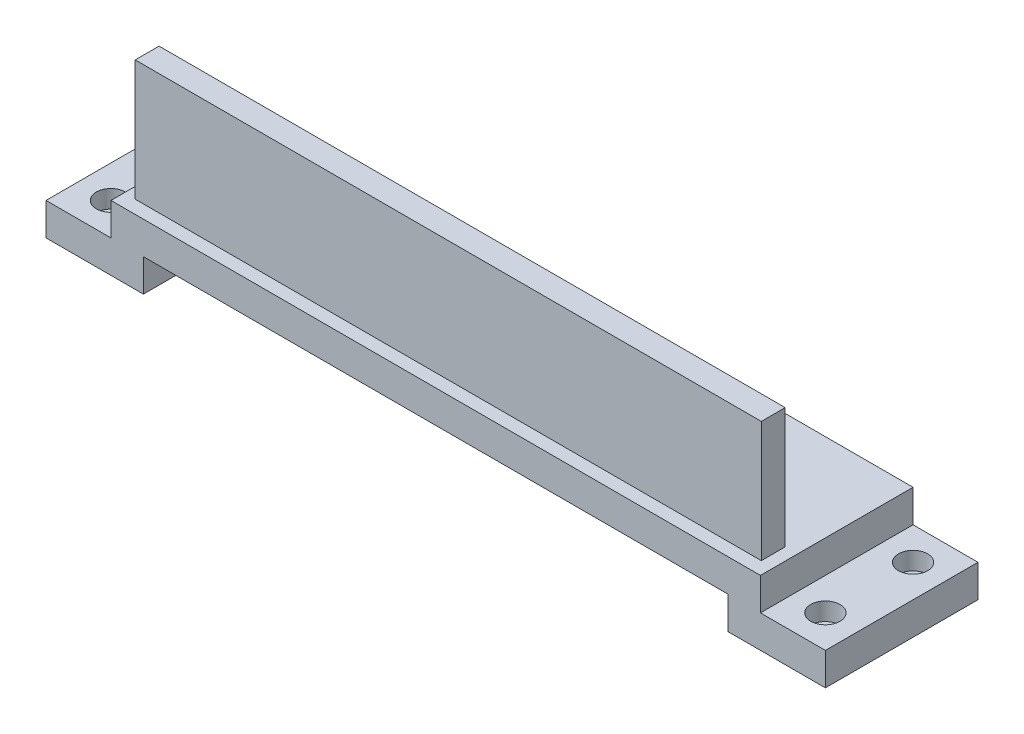
ISO-10303-21;
HEADER;
FILE_DESCRIPTION(('STEP AP214'),'2;1');
FILE_NAME('part.step','',(''),(''),'','','');
FILE_SCHEMA(('AUTOMOTIVE_DESIGN { 1 0 10303 214 1 1 1 1 }'));
ENDSEC;
DATA;
#1=APPLICATION_CONTEXT('core data for automotive mechanical design processes');
#2=APPLICATION_PROTOCOL_DEFINITION('international standard','automotive_design',2000,#1);
#3=PRODUCT_CONTEXT('',#1,'mechanical');
#4=PRODUCT('Part','Part','',(#3));
#5=PRODUCT_RELATED_PRODUCT_CATEGORY('part','',(#4));
#6=PRODUCT_DEFINITION_FORMATION('','',#4);
#7=PRODUCT_DEFINITION_CONTEXT('part definition',#1,'design');
#8=PRODUCT_DEFINITION('design','',#6,#7);
#9=PRODUCT_DEFINITION_SHAPE('','',#8);
#10=(LENGTH_UNIT() NAMED_UNIT(*) SI_UNIT(.MILLI.,.METRE.));
#11=(NAMED_UNIT(*) PLANE_ANGLE_UNIT() SI_UNIT($,.RADIAN.));
#12=(NAMED_UNIT(*) SI_UNIT($,.STERADIAN.) SOLID_ANGLE_UNIT());
#13=UNCERTAINTY_MEASURE_WITH_UNIT(LENGTH_MEASURE(1.E-05),#10,'distance_accuracy_value','');
#14=(GEOMETRIC_REPRESENTATION_CONTEXT(3) GLOBAL_UNCERTAINTY_ASSIGNED_CONTEXT((#13)) GLOBAL_UNIT_ASSIGNED_CONTEXT((#10,
#11,#12)) REPRESENTATION_CONTEXT('',''));
#15=CARTESIAN_POINT('',(0.,0.,0.));
#16=DIRECTION('',(0.,0.,1.));
#17=DIRECTION('',(1.,0.,0.));
#18=AXIS2_PLACEMENT_3D('',#15,#16,#17);
#19=CARTESIAN_POINT('',(240.,20.,47.));
#20=DIRECTION('',(0.,0.,1.));
#21=DIRECTION('',(1.,0.,0.));
#22=AXIS2_PLACEMENT_3D('',#19,#20,#21);
#23=PLANE('',#22);
#24=DIRECTION('',(-1.,0.,0.));
#25=VECTOR('',#24,1.);
#26=CARTESIAN_POINT('',(240.,0.,47.));
#27=LINE('',#26,#25);
#28=CARTESIAN_POINT('',(240.,0.,47.));
#29=VERTEX_POINT('',#28);
#30=CARTESIAN_POINT('',(200.,0.,47.));
#31=VERTEX_POINT('',#30);
#32=EDGE_CURVE('E271',#29,#31,#27,.T.);
#33=ORIENTED_EDGE('',*,*,#32,.T.);
#34=DIRECTION('',(0.,1.,0.));
#35=VECTOR('',#34,1.);
#36=CARTESIAN_POINT('',(200.,0.,47.));
#37=LINE('',#36,#35);
#38=CARTESIAN_POINT('',(200.,20.,47.));
#39=VERTEX_POINT('',#38);
#40=EDGE_CURVE('E276',#31,#39,#37,.T.);
#41=ORIENTED_EDGE('',*,*,#40,.T.);
#42=DIRECTION('',(-1.,0.,0.));
#43=VECTOR('',#42,1.);
#44=CARTESIAN_POINT('',(240.,20.,47.));
#45=LINE('',#44,#43);
#46=CARTESIAN_POINT('',(-200.,20.,47.));
#47=VERTEX_POINT('',#46);
#48=EDGE_CURVE('E356',#39,#47,#45,.T.);
#49=ORIENTED_EDGE('',*,*,#48,.T.);
#50=DIRECTION('',(0.,-1.,0.));
#51=VECTOR('',#50,1.);
#52=CARTESIAN_POINT('',(-200.,20.,47.));
#53=LINE('',#52,#51);
#54=CARTESIAN_POINT('',(-200.,0.,47.));
#55=VERTEX_POINT('',#54);
#56=EDGE_CURVE('E331',#47,#55,#53,.T.);
#57=ORIENTED_EDGE('',*,*,#56,.T.);
#58=DIRECTION('',(-1.,0.,0.));
#59=VECTOR('',#58,1.);
#60=CARTESIAN_POINT('',(-200.,0.,47.));
#61=LINE('',#60,#59);
#62=CARTESIAN_POINT('',(-240.,0.,47.));
#63=VERTEX_POINT('',#62);
#64=EDGE_CURVE('E340',#55,#63,#61,.T.);
#65=ORIENTED_EDGE('',*,*,#64,.T.);
#66=DIRECTION('',(0.,-1.,0.));
#67=VECTOR('',#66,1.);
#68=CARTESIAN_POINT('',(-240.,20.,47.));
#69=LINE('',#68,#67);
#70=CARTESIAN_POINT('',(-240.,-20.,47.));
#71=VERTEX_POINT('',#70);
#72=EDGE_CURVE('E384',#63,#71,#69,.T.);
#73=ORIENTED_EDGE('',*,*,#72,.T.);
#74=DIRECTION('',(-1.,0.,0.));
#75=VECTOR('',#74,1.);
#76=CARTESIAN_POINT('',(240.,-20.,47.));
#77=LINE('',#76,#75);
#78=CARTESIAN_POINT('',(-180.,-20.,47.));
#79=VERTEX_POINT('',#78);
#80=EDGE_CURVE('E367',#79,#71,#77,.T.);
#81=ORIENTED_EDGE('',*,*,#80,.F.);
#82=DIRECTION('',(0.,1.,0.));
#83=VECTOR('',#82,1.);
#84=CARTESIAN_POINT('',(-180.,-20.,47.));
#85=LINE('',#84,#83);
#86=CARTESIAN_POINT('',(-180.,0.,47.));
#87=VERTEX_POINT('',#86);
#88=EDGE_CURVE('E301',#79,#87,#85,.T.);
#89=ORIENTED_EDGE('',*,*,#88,.T.);
#90=DIRECTION('',(1.,0.,0.));
#91=VECTOR('',#90,1.);
#92=CARTESIAN_POINT('',(-180.,0.,47.));
#93=LINE('',#92,#91);
#94=CARTESIAN_POINT('',(180.,0.,47.));
#95=VERTEX_POINT('',#94);
#96=EDGE_CURVE('E306',#87,#95,#93,.T.);
#97=ORIENTED_EDGE('',*,*,#96,.T.);
#98=DIRECTION('',(0.,-1.,0.));
#99=VECTOR('',#98,1.);
#100=CARTESIAN_POINT('',(180.,0.,47.));
#101=LINE('',#100,#99);
#102=CARTESIAN_POINT('',(180.,-20.,47.));
#103=VERTEX_POINT('',#102);
#104=EDGE_CURVE('E300',#95,#103,#101,.T.);
#105=ORIENTED_EDGE('',*,*,#104,.T.);
#106=CARTESIAN_POINT('',(240.,-20.,47.));
#107=VERTEX_POINT('',#106);
#108=EDGE_CURVE('E369',#107,#103,#77,.T.);
#109=ORIENTED_EDGE('',*,*,#108,.F.);
#110=DIRECTION('',(0.,-1.,0.));
#111=VECTOR('',#110,1.);
#112=CARTESIAN_POINT('',(240.,20.,47.));
#113=LINE('',#112,#111);
#114=EDGE_CURVE('E50',#29,#107,#113,.T.);
#115=ORIENTED_EDGE('',*,*,#114,.F.);
#116=EDGE_LOOP('',(#33,#41,#49,#57,#65,#73,#81,#89,#97,#105,#109,#115));
#117=FACE_BOUND('',#116,.T.);
#118=ADVANCED_FACE('F43',(#117),#23,.T.);
#119=CARTESIAN_POINT('',(0.,-20.,0.));
#120=DIRECTION('',(0.,-1.,0.));
#121=DIRECTION('',(0.,0.,-1.));
#122=AXIS2_PLACEMENT_3D('',#119,#120,#121);
#123=PLANE('',#122);
#124=CARTESIAN_POINT('',(220.,-20.,27.));
#125=DIRECTION('',(0.,1.,0.));
#126=DIRECTION('',(0.,0.,1.));
#127=AXIS2_PLACEMENT_3D('',#124,#125,#126);
#128=CIRCLE('',#127,5.50000000000001);
#129=CARTESIAN_POINT('',(220.,-20.,32.5));
#130=VERTEX_POINT('',#129);
#131=EDGE_CURVE('E223',#130,#130,#128,.T.);
#132=ORIENTED_EDGE('',*,*,#131,.T.);
#133=EDGE_LOOP('',(#132));
#134=FACE_BOUND('',#133,.T.);
#135=CARTESIAN_POINT('',(220.,-20.,-27.));
#136=DIRECTION('',(0.,1.,0.));
#137=DIRECTION('',(0.,0.,1.));
#138=AXIS2_PLACEMENT_3D('',#135,#136,#137);
#139=CIRCLE('',#138,5.50000000000001);
#140=CARTESIAN_POINT('',(220.,-20.,-21.5));
#141=VERTEX_POINT('',#140);
#142=EDGE_CURVE('E240',#141,#141,#139,.T.);
#143=ORIENTED_EDGE('',*,*,#142,.T.);
#144=EDGE_LOOP('',(#143));
#145=FACE_BOUND('',#144,.T.);
#146=ORIENTED_EDGE('',*,*,#108,.T.);
#147=DIRECTION('',(0.,0.,-1.));
#148=VECTOR('',#147,1.);
#149=CARTESIAN_POINT('',(180.,-20.,47.));
#150=LINE('',#149,#148);
#151=CARTESIAN_POINT('',(180.,-20.,-47.));
#152=VERTEX_POINT('',#151);
#153=EDGE_CURVE('E309',#103,#152,#150,.T.);
#154=ORIENTED_EDGE('',*,*,#153,.T.);
#155=DIRECTION('',(1.,0.,0.));
#156=VECTOR('',#155,1.);
#157=CARTESIAN_POINT('',(-240.,-20.,-47.));
#158=LINE('',#157,#156);
#159=CARTESIAN_POINT('',(240.,-20.,-47.));
#160=VERTEX_POINT('',#159);
#161=EDGE_CURVE('E377',#152,#160,#158,.T.);
#162=ORIENTED_EDGE('',*,*,#161,.T.);
#163=DIRECTION('',(0.,0.,1.));
#164=VECTOR('',#163,1.);
#165=CARTESIAN_POINT('',(240.,-20.,-47.));
#166=LINE('',#165,#164);
#167=EDGE_CURVE('E355',#160,#107,#166,.T.);
#168=ORIENTED_EDGE('',*,*,#167,.T.);
#169=EDGE_LOOP('',(#146,#154,#162,#168));
#170=FACE_BOUND('',#169,.T.);
#171=ADVANCED_FACE('F405',(#134,#145,#170),#123,.T.);
#172=CARTESIAN_POINT('',(-240.,20.,47.));
#173=DIRECTION('',(-1.,0.,0.));
#174=DIRECTION('',(0.,0.,1.));
#175=AXIS2_PLACEMENT_3D('',#172,#173,#174);
#176=PLANE('',#175);
#177=ORIENTED_EDGE('',*,*,#72,.F.);
#178=DIRECTION('',(0.,0.,-1.));
#179=VECTOR('',#178,1.);
#180=CARTESIAN_POINT('',(-240.,0.,47.));
#181=LINE('',#180,#179);
#182=CARTESIAN_POINT('',(-240.,0.,-47.));
#183=VERTEX_POINT('',#182);
#184=EDGE_CURVE('E350',#63,#183,#181,.T.);
#185=ORIENTED_EDGE('',*,*,#184,.T.);
#186=DIRECTION('',(0.,-1.,0.));
#187=VECTOR('',#186,1.);
#188=CARTESIAN_POINT('',(-240.,20.,-47.));
#189=LINE('',#188,#187);
#190=CARTESIAN_POINT('',(-240.,-20.,-47.));
#191=VERTEX_POINT('',#190);
#192=EDGE_CURVE('E52',#183,#191,#189,.T.);
#193=ORIENTED_EDGE('',*,*,#192,.T.);
#194=DIRECTION('',(0.,0.,-1.));
#195=VECTOR('',#194,1.);
#196=CARTESIAN_POINT('',(-240.,-20.,47.));
#197=LINE('',#196,#195);
#198=EDGE_CURVE('E372',#71,#191,#197,.T.);
#199=ORIENTED_EDGE('',*,*,#198,.F.);
#200=EDGE_LOOP('',(#177,#185,#193,#199));
#201=FACE_BOUND('',#200,.T.);
#202=ADVANCED_FACE('F478',(#201),#176,.T.);
#203=CARTESIAN_POINT('',(0.,20.,0.));
#204=DIRECTION('',(0.,-1.,0.));
#205=DIRECTION('',(0.,0.,-1.));
#206=AXIS2_PLACEMENT_3D('',#203,#204,#205);
#207=PLANE('',#206);
#208=DIRECTION('',(0.,0.,-1.));
#209=VECTOR('',#208,1.);
#210=CARTESIAN_POINT('',(-193.189875817613,20.,38.8700350744145));
#211=LINE('',#210,#209);
#212=CARTESIAN_POINT('',(-193.189875817613,20.,38.8700350744145));
#213=VERTEX_POINT('',#212);
#214=CARTESIAN_POINT('',(-193.189875817613,20.,24.1729073845861));
#215=VERTEX_POINT('',#214);
#216=EDGE_CURVE('E183',#213,#215,#211,.T.);
#217=ORIENTED_EDGE('',*,*,#216,.T.);
#218=DIRECTION('',(1.,0.,0.));
#219=VECTOR('',#218,1.);
#220=CARTESIAN_POINT('',(-193.189875817613,20.,24.1729073845861));
#221=LINE('',#220,#219);
#222=CARTESIAN_POINT('',(192.416342781306,20.,24.1729073845861));
#223=VERTEX_POINT('',#222);
#224=EDGE_CURVE('E64',#215,#223,#221,.T.);
#225=ORIENTED_EDGE('',*,*,#224,.T.);
#226=DIRECTION('',(0.,0.,-1.));
#227=VECTOR('',#226,1.);
#228=CARTESIAN_POINT('',(192.416342781306,20.,38.8700350744145));
#229=LINE('',#228,#227);
#230=CARTESIAN_POINT('',(192.416342781306,20.,38.8700350744145));
#231=VERTEX_POINT('',#230);
#232=EDGE_CURVE('E176',#231,#223,#229,.T.);
#233=ORIENTED_EDGE('',*,*,#232,.F.);
#234=DIRECTION('',(1.,0.,0.));
#235=VECTOR('',#234,1.);
#236=CARTESIAN_POINT('',(-193.189875817613,20.,38.8700350744145));
#237=LINE('',#236,#235);
#238=EDGE_CURVE('E186',#213,#231,#237,.T.);
#239=ORIENTED_EDGE('',*,*,#238,.F.);
#240=EDGE_LOOP('',(#217,#225,#233,#239));
#241=FACE_BOUND('',#240,.T.);
#242=ORIENTED_EDGE('',*,*,#48,.F.);
#243=DIRECTION('',(0.,0.,-1.));
#244=VECTOR('',#243,1.);
#245=CARTESIAN_POINT('',(200.,20.,47.));
#246=LINE('',#245,#244);
#247=CARTESIAN_POINT('',(200.,20.,-47.));
#248=VERTEX_POINT('',#247);
#249=EDGE_CURVE('E290',#39,#248,#246,.T.);
#250=ORIENTED_EDGE('',*,*,#249,.T.);
#251=DIRECTION('',(1.,0.,0.));
#252=VECTOR('',#251,1.);
#253=CARTESIAN_POINT('',(-240.,20.,-47.));
#254=LINE('',#253,#252);
#255=CARTESIAN_POINT('',(-200.,20.,-47.));
#256=VERTEX_POINT('',#255);
#257=EDGE_CURVE('E363',#256,#248,#254,.T.);
#258=ORIENTED_EDGE('',*,*,#257,.F.);
#259=DIRECTION('',(0.,0.,-1.));
#260=VECTOR('',#259,1.);
#261=CARTESIAN_POINT('',(-200.,20.,47.));
#262=LINE('',#261,#260);
#263=EDGE_CURVE('E341',#47,#256,#262,.T.);
#264=ORIENTED_EDGE('',*,*,#263,.F.);
#265=EDGE_LOOP('',(#242,#250,#258,#264));
#266=FACE_BOUND('',#265,.T.);
#267=ADVANCED_FACE('F489',(#241,#266),#207,.F.);
#268=CARTESIAN_POINT('',(240.,20.,-47.));
#269=DIRECTION('',(1.,0.,0.));
#270=DIRECTION('',(0.,0.,-1.));
#271=AXIS2_PLACEMENT_3D('',#268,#269,#270);
#272=PLANE('',#271);
#273=DIRECTION('',(0.,0.,-1.));
#274=VECTOR('',#273,1.);
#275=CARTESIAN_POINT('',(240.,0.,47.));
#276=LINE('',#275,#274);
#277=CARTESIAN_POINT('',(240.,0.,-47.));
#278=VERTEX_POINT('',#277);
#279=EDGE_CURVE('E281',#29,#278,#276,.T.);
#280=ORIENTED_EDGE('',*,*,#279,.F.);
#281=ORIENTED_EDGE('',*,*,#114,.T.);
#282=ORIENTED_EDGE('',*,*,#167,.F.);
#283=DIRECTION('',(0.,-1.,0.));
#284=VECTOR('',#283,1.);
#285=CARTESIAN_POINT('',(240.,20.,-47.));
#286=LINE('',#285,#284);
#287=EDGE_CURVE('E11',#278,#160,#286,.T.);
#288=ORIENTED_EDGE('',*,*,#287,.F.);
#289=EDGE_LOOP('',(#280,#281,#282,#288));
#290=FACE_BOUND('',#289,.T.);
#291=ADVANCED_FACE('F44',(#290),#272,.T.);
#292=CARTESIAN_POINT('',(-240.,20.,-47.));
#293=DIRECTION('',(0.,0.,-1.));
#294=DIRECTION('',(-1.,0.,0.));
#295=AXIS2_PLACEMENT_3D('',#292,#293,#294);
#296=PLANE('',#295);
#297=DIRECTION('',(-1.,0.,0.));
#298=VECTOR('',#297,1.);
#299=CARTESIAN_POINT('',(240.,0.,-47.));
#300=LINE('',#299,#298);
#301=CARTESIAN_POINT('',(200.,0.,-47.));
#302=VERTEX_POINT('',#301);
#303=EDGE_CURVE('E68',#278,#302,#300,.T.);
#304=ORIENTED_EDGE('',*,*,#303,.F.);
#305=ORIENTED_EDGE('',*,*,#287,.T.);
#306=ORIENTED_EDGE('',*,*,#161,.F.);
#307=DIRECTION('',(0.,-1.,0.));
#308=VECTOR('',#307,1.);
#309=CARTESIAN_POINT('',(180.,0.,-47.));
#310=LINE('',#309,#308);
#311=CARTESIAN_POINT('',(180.,0.,-47.));
#312=VERTEX_POINT('',#311);
#313=EDGE_CURVE('E293',#312,#152,#310,.T.);
#314=ORIENTED_EDGE('',*,*,#313,.F.);
#315=DIRECTION('',(1.,0.,0.));
#316=VECTOR('',#315,1.);
#317=CARTESIAN_POINT('',(-180.,0.,-47.));
#318=LINE('',#317,#316);
#319=CARTESIAN_POINT('',(-180.,0.,-47.));
#320=VERTEX_POINT('',#319);
#321=EDGE_CURVE('E305',#320,#312,#318,.T.);
#322=ORIENTED_EDGE('',*,*,#321,.F.);
#323=DIRECTION('',(0.,1.,0.));
#324=VECTOR('',#323,1.);
#325=CARTESIAN_POINT('',(-180.,-20.,-47.));
#326=LINE('',#325,#324);
#327=CARTESIAN_POINT('',(-180.,-20.,-47.));
#328=VERTEX_POINT('',#327);
#329=EDGE_CURVE('E312',#328,#320,#326,.T.);
#330=ORIENTED_EDGE('',*,*,#329,.F.);
#331=EDGE_CURVE('E365',#191,#328,#158,.T.);
#332=ORIENTED_EDGE('',*,*,#331,.F.);
#333=ORIENTED_EDGE('',*,*,#192,.F.);
#334=DIRECTION('',(-1.,0.,0.));
#335=VECTOR('',#334,1.);
#336=CARTESIAN_POINT('',(-200.,0.,-47.));
#337=LINE('',#336,#335);
#338=CARTESIAN_POINT('',(-200.,0.,-47.));
#339=VERTEX_POINT('',#338);
#340=EDGE_CURVE('E336',#339,#183,#337,.T.);
#341=ORIENTED_EDGE('',*,*,#340,.F.);
#342=DIRECTION('',(0.,-1.,0.));
#343=VECTOR('',#342,1.);
#344=CARTESIAN_POINT('',(-200.,20.,-47.));
#345=LINE('',#344,#343);
#346=EDGE_CURVE('E321',#256,#339,#345,.T.);
#347=ORIENTED_EDGE('',*,*,#346,.F.);
#348=ORIENTED_EDGE('',*,*,#257,.T.);
#349=DIRECTION('',(0.,1.,0.));
#350=VECTOR('',#349,1.);
#351=CARTESIAN_POINT('',(200.,0.,-47.));
#352=LINE('',#351,#350);
#353=EDGE_CURVE('E280',#302,#248,#352,.T.);
#354=ORIENTED_EDGE('',*,*,#353,.F.);
#355=EDGE_LOOP('',(#304,#305,#306,#314,#322,#330,#332,#333,#341,#347,#348,#354));
#356=FACE_BOUND('',#355,.T.);
#357=ADVANCED_FACE('F473',(#356),#296,.T.);
#358=CARTESIAN_POINT('',(-220.,-20.,27.));
#359=DIRECTION('',(0.,1.,0.));
#360=DIRECTION('',(0.,0.,1.));
#361=AXIS2_PLACEMENT_3D('',#358,#359,#360);
#362=CIRCLE('',#361,5.50000000000001);
#363=CARTESIAN_POINT('',(-220.,-20.,32.5));
#364=VERTEX_POINT('',#363);
#365=EDGE_CURVE('E254',#364,#364,#362,.T.);
#366=ORIENTED_EDGE('',*,*,#365,.T.);
#367=EDGE_LOOP('',(#366));
#368=FACE_BOUND('',#367,.T.);
#369=CARTESIAN_POINT('',(-220.,-20.,-27.));
#370=DIRECTION('',(0.,1.,0.));
#371=DIRECTION('',(0.,0.,1.));
#372=AXIS2_PLACEMENT_3D('',#369,#370,#371);
#373=CIRCLE('',#372,5.50000000000001);
#374=CARTESIAN_POINT('',(-220.,-20.,-21.5));
#375=VERTEX_POINT('',#374);
#376=EDGE_CURVE('E269',#375,#375,#373,.T.);
#377=ORIENTED_EDGE('',*,*,#376,.T.);
#378=EDGE_LOOP('',(#377));
#379=FACE_BOUND('',#378,.T.);
#380=DIRECTION('',(0.,0.,-1.));
#381=VECTOR('',#380,1.);
#382=CARTESIAN_POINT('',(-180.,-20.,47.));
#383=LINE('',#382,#381);
#384=EDGE_CURVE('E326',#79,#328,#383,.T.);
#385=ORIENTED_EDGE('',*,*,#384,.F.);
#386=ORIENTED_EDGE('',*,*,#80,.T.);
#387=ORIENTED_EDGE('',*,*,#198,.T.);
#388=ORIENTED_EDGE('',*,*,#331,.T.);
#389=EDGE_LOOP('',(#385,#386,#387,#388));
#390=FACE_BOUND('',#389,.T.);
#391=ADVANCED_FACE('F461',(#368,#379,#390),#123,.T.);
#392=CARTESIAN_POINT('',(-200.,0.,47.));
#393=DIRECTION('',(0.,-1.,0.));
#394=DIRECTION('',(0.,0.,-1.));
#395=AXIS2_PLACEMENT_3D('',#392,#393,#394);
#396=PLANE('',#395);
#397=CARTESIAN_POINT('',(-220.,0.,27.));
#398=DIRECTION('',(0.,1.,0.));
#399=DIRECTION('',(0.,0.,1.));
#400=AXIS2_PLACEMENT_3D('',#397,#398,#399);
#401=CIRCLE('',#400,8.99999999999998);
#402=CARTESIAN_POINT('',(-220.,0.,36.));
#403=VERTEX_POINT('',#402);
#404=EDGE_CURVE('E241',#403,#403,#401,.T.);
#405=ORIENTED_EDGE('',*,*,#404,.F.);
#406=EDGE_LOOP('',(#405));
#407=FACE_BOUND('',#406,.T.);
#408=CARTESIAN_POINT('',(-220.,0.,-27.));
#409=DIRECTION('',(0.,1.,0.));
#410=DIRECTION('',(0.,0.,1.));
#411=AXIS2_PLACEMENT_3D('',#408,#409,#410);
#412=CIRCLE('',#411,8.99999999999998);
#413=CARTESIAN_POINT('',(-220.,0.,-18.));
#414=VERTEX_POINT('',#413);
#415=EDGE_CURVE('E256',#414,#414,#412,.T.);
#416=ORIENTED_EDGE('',*,*,#415,.F.);
#417=EDGE_LOOP('',(#416));
#418=FACE_BOUND('',#417,.T.);
#419=ORIENTED_EDGE('',*,*,#340,.T.);
#420=ORIENTED_EDGE('',*,*,#184,.F.);
#421=ORIENTED_EDGE('',*,*,#64,.F.);
#422=DIRECTION('',(0.,0.,-1.));
#423=VECTOR('',#422,1.);
#424=CARTESIAN_POINT('',(-200.,0.,47.));
#425=LINE('',#424,#423);
#426=EDGE_CURVE('E351',#55,#339,#425,.T.);
#427=ORIENTED_EDGE('',*,*,#426,.T.);
#428=EDGE_LOOP('',(#419,#420,#421,#427));
#429=FACE_BOUND('',#428,.T.);
#430=ADVANCED_FACE('F485',(#407,#418,#429),#396,.F.);
#431=CARTESIAN_POINT('',(-200.,20.,47.));
#432=DIRECTION('',(1.,0.,0.));
#433=DIRECTION('',(0.,0.,-1.));
#434=AXIS2_PLACEMENT_3D('',#431,#432,#433);
#435=PLANE('',#434);
#436=ORIENTED_EDGE('',*,*,#346,.T.);
#437=ORIENTED_EDGE('',*,*,#426,.F.);
#438=ORIENTED_EDGE('',*,*,#56,.F.);
#439=ORIENTED_EDGE('',*,*,#263,.T.);
#440=EDGE_LOOP('',(#436,#437,#438,#439));
#441=FACE_BOUND('',#440,.T.);
#442=ADVANCED_FACE('F487',(#441),#435,.F.);
#443=CARTESIAN_POINT('',(180.,0.,47.));
#444=DIRECTION('',(1.,0.,0.));
#445=DIRECTION('',(0.,0.,-1.));
#446=AXIS2_PLACEMENT_3D('',#443,#444,#445);
#447=PLANE('',#446);
#448=ORIENTED_EDGE('',*,*,#313,.T.);
#449=ORIENTED_EDGE('',*,*,#153,.F.);
#450=ORIENTED_EDGE('',*,*,#104,.F.);
#451=DIRECTION('',(0.,0.,-1.));
#452=VECTOR('',#451,1.);
#453=CARTESIAN_POINT('',(180.,0.,47.));
#454=LINE('',#453,#452);
#455=EDGE_CURVE('E316',#95,#312,#454,.T.);
#456=ORIENTED_EDGE('',*,*,#455,.T.);
#457=EDGE_LOOP('',(#448,#449,#450,#456));
#458=FACE_BOUND('',#457,.T.);
#459=ADVANCED_FACE('F475',(#458),#447,.F.);
#460=CARTESIAN_POINT('',(-180.,0.,47.));
#461=DIRECTION('',(0.,1.,0.));
#462=DIRECTION('',(0.,0.,1.));
#463=AXIS2_PLACEMENT_3D('',#460,#461,#462);
#464=PLANE('',#463);
#465=ORIENTED_EDGE('',*,*,#321,.T.);
#466=ORIENTED_EDGE('',*,*,#455,.F.);
#467=ORIENTED_EDGE('',*,*,#96,.F.);
#468=DIRECTION('',(0.,0.,-1.));
#469=VECTOR('',#468,1.);
#470=CARTESIAN_POINT('',(-180.,0.,47.));
#471=LINE('',#470,#469);
#472=EDGE_CURVE('E325',#87,#320,#471,.T.);
#473=ORIENTED_EDGE('',*,*,#472,.T.);
#474=EDGE_LOOP('',(#465,#466,#467,#473));
#475=FACE_BOUND('',#474,.T.);
#476=ADVANCED_FACE('F474',(#475),#464,.F.);
#477=CARTESIAN_POINT('',(-180.,-20.,47.));
#478=DIRECTION('',(-1.,0.,0.));
#479=DIRECTION('',(0.,0.,1.));
#480=AXIS2_PLACEMENT_3D('',#477,#478,#479);
#481=PLANE('',#480);
#482=ORIENTED_EDGE('',*,*,#329,.T.);
#483=ORIENTED_EDGE('',*,*,#472,.F.);
#484=ORIENTED_EDGE('',*,*,#88,.F.);
#485=ORIENTED_EDGE('',*,*,#384,.T.);
#486=EDGE_LOOP('',(#482,#483,#484,#485));
#487=FACE_BOUND('',#486,.T.);
#488=ADVANCED_FACE('F470',(#487),#481,.F.);
#489=CARTESIAN_POINT('',(200.,0.,47.));
#490=DIRECTION('',(-1.,0.,0.));
#491=DIRECTION('',(0.,0.,1.));
#492=AXIS2_PLACEMENT_3D('',#489,#490,#491);
#493=PLANE('',#492);
#494=ORIENTED_EDGE('',*,*,#353,.T.);
#495=ORIENTED_EDGE('',*,*,#249,.F.);
#496=ORIENTED_EDGE('',*,*,#40,.F.);
#497=DIRECTION('',(0.,0.,-1.));
#498=VECTOR('',#497,1.);
#499=CARTESIAN_POINT('',(200.,0.,47.));
#500=LINE('',#499,#498);
#501=EDGE_CURVE('E292',#31,#302,#500,.T.);
#502=ORIENTED_EDGE('',*,*,#501,.T.);
#503=EDGE_LOOP('',(#494,#495,#496,#502));
#504=FACE_BOUND('',#503,.T.);
#505=ADVANCED_FACE('F491',(#504),#493,.F.);
#506=CARTESIAN_POINT('',(240.,0.,47.));
#507=DIRECTION('',(0.,-1.,0.));
#508=DIRECTION('',(0.,0.,-1.));
#509=AXIS2_PLACEMENT_3D('',#506,#507,#508);
#510=PLANE('',#509);
#511=CARTESIAN_POINT('',(220.,0.,27.));
#512=DIRECTION('',(0.,1.,0.));
#513=DIRECTION('',(0.,0.,1.));
#514=AXIS2_PLACEMENT_3D('',#511,#512,#513);
#515=CIRCLE('',#514,8.99999999999998);
#516=CARTESIAN_POINT('',(220.,0.,36.));
#517=VERTEX_POINT('',#516);
#518=EDGE_CURVE('E204',#517,#517,#515,.T.);
#519=ORIENTED_EDGE('',*,*,#518,.F.);
#520=EDGE_LOOP('',(#519));
#521=FACE_BOUND('',#520,.T.);
#522=CARTESIAN_POINT('',(220.,0.,-27.));
#523=DIRECTION('',(0.,1.,0.));
#524=DIRECTION('',(0.,0.,1.));
#525=AXIS2_PLACEMENT_3D('',#522,#523,#524);
#526=CIRCLE('',#525,8.99999999999998);
#527=CARTESIAN_POINT('',(220.,0.,-18.));
#528=VERTEX_POINT('',#527);
#529=EDGE_CURVE('E222',#528,#528,#526,.T.);
#530=ORIENTED_EDGE('',*,*,#529,.F.);
#531=EDGE_LOOP('',(#530));
#532=FACE_BOUND('',#531,.T.);
#533=ORIENTED_EDGE('',*,*,#303,.T.);
#534=ORIENTED_EDGE('',*,*,#501,.F.);
#535=ORIENTED_EDGE('',*,*,#32,.F.);
#536=ORIENTED_EDGE('',*,*,#279,.T.);
#537=EDGE_LOOP('',(#533,#534,#535,#536));
#538=FACE_BOUND('',#537,.T.);
#539=ADVANCED_FACE('F492',(#521,#532,#538),#510,.F.);
#540=CARTESIAN_POINT('',(-220.,0.,-27.));
#541=DIRECTION('',(0.,1.,0.));
#542=DIRECTION('',(0.,0.,1.));
#543=AXIS2_PLACEMENT_3D('',#540,#541,#542);
#544=CYLINDRICAL_SURFACE('',#543,5.50000000000001);
#545=ORIENTED_EDGE('',*,*,#376,.F.);
#546=EDGE_LOOP('',(#545));
#547=FACE_BOUND('',#546,.T.);
#548=CARTESIAN_POINT('',(-220.,-11.,-27.));
#549=DIRECTION('',(0.,1.,0.));
#550=DIRECTION('',(0.,0.,1.));
#551=AXIS2_PLACEMENT_3D('',#548,#549,#550);
#552=CIRCLE('',#551,5.50000000000001);
#553=CARTESIAN_POINT('',(-220.,-11.,-21.5));
#554=VERTEX_POINT('',#553);
#555=EDGE_CURVE('E262',#554,#554,#552,.T.);
#556=ORIENTED_EDGE('',*,*,#555,.T.);
#557=EDGE_LOOP('',(#556));
#558=FACE_BOUND('',#557,.T.);
#559=ADVANCED_FACE('F500',(#547,#558),#544,.F.);
#560=CARTESIAN_POINT('',(-214.5,-11.,-27.));
#561=DIRECTION('',(0.,-1.,0.));
#562=DIRECTION('',(0.,0.,-1.));
#563=AXIS2_PLACEMENT_3D('',#560,#561,#562);
#564=PLANE('',#563);
#565=ORIENTED_EDGE('',*,*,#555,.F.);
#566=EDGE_LOOP('',(#565));
#567=FACE_BOUND('',#566,.T.);
#568=CARTESIAN_POINT('',(-220.,-11.,-27.));
#569=DIRECTION('',(0.,1.,0.));
#570=DIRECTION('',(0.,0.,1.));
#571=AXIS2_PLACEMENT_3D('',#568,#569,#570);
#572=CIRCLE('',#571,8.99999999999998);
#573=CARTESIAN_POINT('',(-220.,-11.,-18.));
#574=VERTEX_POINT('',#573);
#575=EDGE_CURVE('E264',#574,#574,#572,.T.);
#576=ORIENTED_EDGE('',*,*,#575,.T.);
#577=EDGE_LOOP('',(#576));
#578=FACE_BOUND('',#577,.T.);
#579=ADVANCED_FACE('F502',(#567,#578),#564,.F.);
#580=CARTESIAN_POINT('',(-220.,0.,-27.));
#581=DIRECTION('',(0.,1.,0.));
#582=DIRECTION('',(0.,0.,1.));
#583=AXIS2_PLACEMENT_3D('',#580,#581,#582);
#584=CYLINDRICAL_SURFACE('',#583,8.99999999999998);
#585=ORIENTED_EDGE('',*,*,#575,.F.);
#586=EDGE_LOOP('',(#585));
#587=FACE_BOUND('',#586,.T.);
#588=ORIENTED_EDGE('',*,*,#415,.T.);
#589=EDGE_LOOP('',(#588));
#590=FACE_BOUND('',#589,.T.);
#591=ADVANCED_FACE('F577',(#587,#590),#584,.F.);
#592=CARTESIAN_POINT('',(-220.,0.,27.));
#593=DIRECTION('',(0.,1.,0.));
#594=DIRECTION('',(0.,0.,1.));
#595=AXIS2_PLACEMENT_3D('',#592,#593,#594);
#596=CYLINDRICAL_SURFACE('',#595,5.50000000000001);
#597=ORIENTED_EDGE('',*,*,#365,.F.);
#598=EDGE_LOOP('',(#597));
#599=FACE_BOUND('',#598,.T.);
#600=CARTESIAN_POINT('',(-220.,-11.,27.));
#601=DIRECTION('',(0.,1.,0.));
#602=DIRECTION('',(0.,0.,1.));
#603=AXIS2_PLACEMENT_3D('',#600,#601,#602);
#604=CIRCLE('',#603,5.50000000000001);
#605=CARTESIAN_POINT('',(-220.,-11.,32.5));
#606=VERTEX_POINT('',#605);
#607=EDGE_CURVE('E248',#606,#606,#604,.T.);
#608=ORIENTED_EDGE('',*,*,#607,.T.);
#609=EDGE_LOOP('',(#608));
#610=FACE_BOUND('',#609,.T.);
#611=ADVANCED_FACE('F589',(#599,#610),#596,.F.);
#612=CARTESIAN_POINT('',(-214.5,-11.,27.));
#613=DIRECTION('',(0.,-1.,0.));
#614=DIRECTION('',(0.,0.,-1.));
#615=AXIS2_PLACEMENT_3D('',#612,#613,#614);
#616=PLANE('',#615);
#617=ORIENTED_EDGE('',*,*,#607,.F.);
#618=EDGE_LOOP('',(#617));
#619=FACE_BOUND('',#618,.T.);
#620=CARTESIAN_POINT('',(-220.,-11.,27.));
#621=DIRECTION('',(0.,1.,0.));
#622=DIRECTION('',(0.,0.,1.));
#623=AXIS2_PLACEMENT_3D('',#620,#621,#622);
#624=CIRCLE('',#623,8.99999999999998);
#625=CARTESIAN_POINT('',(-220.,-11.,36.));
#626=VERTEX_POINT('',#625);
#627=EDGE_CURVE('E244',#626,#626,#624,.T.);
#628=ORIENTED_EDGE('',*,*,#627,.T.);
#629=EDGE_LOOP('',(#628));
#630=FACE_BOUND('',#629,.T.);
#631=ADVANCED_FACE('F597',(#619,#630),#616,.F.);
#632=CARTESIAN_POINT('',(-220.,0.,27.));
#633=DIRECTION('',(0.,1.,0.));
#634=DIRECTION('',(0.,0.,1.));
#635=AXIS2_PLACEMENT_3D('',#632,#633,#634);
#636=CYLINDRICAL_SURFACE('',#635,8.99999999999998);
#637=ORIENTED_EDGE('',*,*,#627,.F.);
#638=EDGE_LOOP('',(#637));
#639=FACE_BOUND('',#638,.T.);
#640=ORIENTED_EDGE('',*,*,#404,.T.);
#641=EDGE_LOOP('',(#640));
#642=FACE_BOUND('',#641,.T.);
#643=ADVANCED_FACE('F609',(#639,#642),#636,.F.);
#644=CARTESIAN_POINT('',(220.,0.,-27.));
#645=DIRECTION('',(0.,1.,0.));
#646=DIRECTION('',(0.,0.,1.));
#647=AXIS2_PLACEMENT_3D('',#644,#645,#646);
#648=CYLINDRICAL_SURFACE('',#647,5.50000000000001);
#649=ORIENTED_EDGE('',*,*,#142,.F.);
#650=EDGE_LOOP('',(#649));
#651=FACE_BOUND('',#650,.T.);
#652=CARTESIAN_POINT('',(220.,-11.,-27.));
#653=DIRECTION('',(0.,1.,0.));
#654=DIRECTION('',(0.,0.,1.));
#655=AXIS2_PLACEMENT_3D('',#652,#653,#654);
#656=CIRCLE('',#655,5.50000000000001);
#657=CARTESIAN_POINT('',(220.,-11.,-21.5));
#658=VERTEX_POINT('',#657);
#659=EDGE_CURVE('E231',#658,#658,#656,.T.);
#660=ORIENTED_EDGE('',*,*,#659,.T.);
#661=EDGE_LOOP('',(#660));
#662=FACE_BOUND('',#661,.T.);
#663=ADVANCED_FACE('F618',(#651,#662),#648,.F.);
#664=CARTESIAN_POINT('',(225.5,-11.,-27.));
#665=DIRECTION('',(0.,-1.,0.));
#666=DIRECTION('',(0.,0.,-1.));
#667=AXIS2_PLACEMENT_3D('',#664,#665,#666);
#668=PLANE('',#667);
#669=ORIENTED_EDGE('',*,*,#659,.F.);
#670=EDGE_LOOP('',(#669));
#671=FACE_BOUND('',#670,.T.);
#672=CARTESIAN_POINT('',(220.,-11.,-27.));
#673=DIRECTION('',(0.,1.,0.));
#674=DIRECTION('',(0.,0.,1.));
#675=AXIS2_PLACEMENT_3D('',#672,#673,#674);
#676=CIRCLE('',#675,8.99999999999998);
#677=CARTESIAN_POINT('',(220.,-11.,-18.));
#678=VERTEX_POINT('',#677);
#679=EDGE_CURVE('E230',#678,#678,#676,.T.);
#680=ORIENTED_EDGE('',*,*,#679,.T.);
#681=EDGE_LOOP('',(#680));
#682=FACE_BOUND('',#681,.T.);
#683=ADVANCED_FACE('F626',(#671,#682),#668,.F.);
#684=CARTESIAN_POINT('',(220.,0.,-27.));
#685=DIRECTION('',(0.,1.,0.));
#686=DIRECTION('',(0.,0.,1.));
#687=AXIS2_PLACEMENT_3D('',#684,#685,#686);
#688=CYLINDRICAL_SURFACE('',#687,8.99999999999998);
#689=ORIENTED_EDGE('',*,*,#679,.F.);
#690=EDGE_LOOP('',(#689));
#691=FACE_BOUND('',#690,.T.);
#692=ORIENTED_EDGE('',*,*,#529,.T.);
#693=EDGE_LOOP('',(#692));
#694=FACE_BOUND('',#693,.T.);
#695=ADVANCED_FACE('F636',(#691,#694),#688,.F.);
#696=CARTESIAN_POINT('',(220.,0.,27.));
#697=DIRECTION('',(0.,1.,0.));
#698=DIRECTION('',(0.,0.,1.));
#699=AXIS2_PLACEMENT_3D('',#696,#697,#698);
#700=CYLINDRICAL_SURFACE('',#699,5.50000000000001);
#701=ORIENTED_EDGE('',*,*,#131,.F.);
#702=EDGE_LOOP('',(#701));
#703=FACE_BOUND('',#702,.T.);
#704=CARTESIAN_POINT('',(220.,-11.,27.));
#705=DIRECTION('',(0.,1.,0.));
#706=DIRECTION('',(0.,0.,1.));
#707=AXIS2_PLACEMENT_3D('',#704,#705,#706);
#708=CIRCLE('',#707,5.50000000000001);
#709=CARTESIAN_POINT('',(220.,-11.,32.5));
#710=VERTEX_POINT('',#709);
#711=EDGE_CURVE('E216',#710,#710,#708,.T.);
#712=ORIENTED_EDGE('',*,*,#711,.T.);
#713=EDGE_LOOP('',(#712));
#714=FACE_BOUND('',#713,.T.);
#715=ADVANCED_FACE('F649',(#703,#714),#700,.F.);
#716=CARTESIAN_POINT('',(225.5,-11.,27.));
#717=DIRECTION('',(0.,-1.,0.));
#718=DIRECTION('',(0.,0.,-1.));
#719=AXIS2_PLACEMENT_3D('',#716,#717,#718);
#720=PLANE('',#719);
#721=ORIENTED_EDGE('',*,*,#711,.F.);
#722=EDGE_LOOP('',(#721));
#723=FACE_BOUND('',#722,.T.);
#724=CARTESIAN_POINT('',(220.,-11.,27.));
#725=DIRECTION('',(0.,1.,0.));
#726=DIRECTION('',(0.,0.,1.));
#727=AXIS2_PLACEMENT_3D('',#724,#725,#726);
#728=CIRCLE('',#727,8.99999999999998);
#729=CARTESIAN_POINT('',(220.,-11.,36.));
#730=VERTEX_POINT('',#729);
#731=EDGE_CURVE('E215',#730,#730,#728,.T.);
#732=ORIENTED_EDGE('',*,*,#731,.T.);
#733=EDGE_LOOP('',(#732));
#734=FACE_BOUND('',#733,.T.);
#735=ADVANCED_FACE('F658',(#723,#734),#720,.F.);
#736=CARTESIAN_POINT('',(220.,0.,27.));
#737=DIRECTION('',(0.,1.,0.));
#738=DIRECTION('',(0.,0.,1.));
#739=AXIS2_PLACEMENT_3D('',#736,#737,#738);
#740=CYLINDRICAL_SURFACE('',#739,8.99999999999998);
#741=ORIENTED_EDGE('',*,*,#731,.F.);
#742=EDGE_LOOP('',(#741));
#743=FACE_BOUND('',#742,.T.);
#744=ORIENTED_EDGE('',*,*,#518,.T.);
#745=EDGE_LOOP('',(#744));
#746=FACE_BOUND('',#745,.T.);
#747=ADVANCED_FACE('F669',(#743,#746),#740,.F.);
#748=CARTESIAN_POINT('',(-193.189875817613,94.29,24.1729073845861));
#749=DIRECTION('',(0.,0.,-1.));
#750=DIRECTION('',(-1.,0.,0.));
#751=AXIS2_PLACEMENT_3D('',#748,#749,#750);
#752=PLANE('',#751);
#753=ORIENTED_EDGE('',*,*,#224,.F.);
#754=DIRECTION('',(0.,-1.,0.));
#755=VECTOR('',#754,1.);
#756=CARTESIAN_POINT('',(-193.189875817613,94.29,24.1729073845861));
#757=LINE('',#756,#755);
#758=CARTESIAN_POINT('',(-193.189875817613,94.29,24.1729073845861));
#759=VERTEX_POINT('',#758);
#760=EDGE_CURVE('E185',#759,#215,#757,.T.);
#761=ORIENTED_EDGE('',*,*,#760,.F.);
#762=DIRECTION('',(1.,0.,0.));
#763=VECTOR('',#762,1.);
#764=CARTESIAN_POINT('',(-193.189875817613,94.29,24.1729073845861));
#765=LINE('',#764,#763);
#766=CARTESIAN_POINT('',(192.416342781306,94.29,24.1729073845861));
#767=VERTEX_POINT('',#766);
#768=EDGE_CURVE('E161',#759,#767,#765,.T.);
#769=ORIENTED_EDGE('',*,*,#768,.T.);
#770=DIRECTION('',(0.,-1.,0.));
#771=VECTOR('',#770,1.);
#772=CARTESIAN_POINT('',(192.416342781306,94.29,24.1729073845861));
#773=LINE('',#772,#771);
#774=EDGE_CURVE('E173',#767,#223,#773,.T.);
#775=ORIENTED_EDGE('',*,*,#774,.T.);
#776=EDGE_LOOP('',(#753,#761,#769,#775));
#777=FACE_BOUND('',#776,.T.);
#778=ADVANCED_FACE('F181',(#777),#752,.T.);
#779=CARTESIAN_POINT('',(-193.189875817613,94.29,38.8700350744145));
#780=DIRECTION('',(-1.,0.,0.));
#781=DIRECTION('',(0.,0.,1.));
#782=AXIS2_PLACEMENT_3D('',#779,#780,#781);
#783=PLANE('',#782);
#784=ORIENTED_EDGE('',*,*,#216,.F.);
#785=DIRECTION('',(0.,-1.,0.));
#786=VECTOR('',#785,1.);
#787=CARTESIAN_POINT('',(-193.189875817613,94.29,38.8700350744145));
#788=LINE('',#787,#786);
#789=CARTESIAN_POINT('',(-193.189875817613,94.29,38.8700350744145));
#790=VERTEX_POINT('',#789);
#791=EDGE_CURVE('E202',#790,#213,#788,.T.);
#792=ORIENTED_EDGE('',*,*,#791,.F.);
#793=DIRECTION('',(0.,0.,-1.));
#794=VECTOR('',#793,1.);
#795=CARTESIAN_POINT('',(-193.189875817613,94.29,38.8700350744145));
#796=LINE('',#795,#794);
#797=EDGE_CURVE('E177',#790,#759,#796,.T.);
#798=ORIENTED_EDGE('',*,*,#797,.T.);
#799=ORIENTED_EDGE('',*,*,#760,.T.);
#800=EDGE_LOOP('',(#784,#792,#798,#799));
#801=FACE_BOUND('',#800,.T.);
#802=ADVANCED_FACE('F684',(#801),#783,.T.);
#803=CARTESIAN_POINT('',(-193.189875817613,94.29,38.8700350744145));
#804=DIRECTION('',(0.,0.,-1.));
#805=DIRECTION('',(-1.,0.,0.));
#806=AXIS2_PLACEMENT_3D('',#803,#804,#805);
#807=PLANE('',#806);
#808=ORIENTED_EDGE('',*,*,#238,.T.);
#809=DIRECTION('',(0.,-1.,0.));
#810=VECTOR('',#809,1.);
#811=CARTESIAN_POINT('',(192.416342781306,94.29,38.8700350744145));
#812=LINE('',#811,#810);
#813=CARTESIAN_POINT('',(192.416342781306,94.29,38.8700350744145));
#814=VERTEX_POINT('',#813);
#815=EDGE_CURVE('E178',#814,#231,#812,.T.);
#816=ORIENTED_EDGE('',*,*,#815,.F.);
#817=DIRECTION('',(1.,0.,0.));
#818=VECTOR('',#817,1.);
#819=CARTESIAN_POINT('',(-193.189875817613,94.29,38.8700350744145));
#820=LINE('',#819,#818);
#821=EDGE_CURVE('E168',#790,#814,#820,.T.);
#822=ORIENTED_EDGE('',*,*,#821,.F.);
#823=ORIENTED_EDGE('',*,*,#791,.T.);
#824=EDGE_LOOP('',(#808,#816,#822,#823));
#825=FACE_BOUND('',#824,.T.);
#826=ADVANCED_FACE('F692',(#825),#807,.F.);
#827=CARTESIAN_POINT('',(192.416342781306,94.29,38.8700350744145));
#828=DIRECTION('',(-1.,0.,0.));
#829=DIRECTION('',(0.,0.,1.));
#830=AXIS2_PLACEMENT_3D('',#827,#828,#829);
#831=PLANE('',#830);
#832=ORIENTED_EDGE('',*,*,#232,.T.);
#833=ORIENTED_EDGE('',*,*,#774,.F.);
#834=DIRECTION('',(0.,0.,-1.));
#835=VECTOR('',#834,1.);
#836=CARTESIAN_POINT('',(192.416342781306,94.29,38.8700350744145));
#837=LINE('',#836,#835);
#838=EDGE_CURVE('E156',#814,#767,#837,.T.);
#839=ORIENTED_EDGE('',*,*,#838,.F.);
#840=ORIENTED_EDGE('',*,*,#815,.T.);
#841=EDGE_LOOP('',(#832,#833,#839,#840));
#842=FACE_BOUND('',#841,.T.);
#843=ADVANCED_FACE('F172',(#842),#831,.F.);
#844=CARTESIAN_POINT('',(0.,94.29,0.));
#845=DIRECTION('',(0.,1.,0.));
#846=DIRECTION('',(0.,0.,1.));
#847=AXIS2_PLACEMENT_3D('',#844,#845,#846);
#848=PLANE('',#847);
#849=ORIENTED_EDGE('',*,*,#768,.F.);
#850=ORIENTED_EDGE('',*,*,#797,.F.);
#851=ORIENTED_EDGE('',*,*,#821,.T.);
#852=ORIENTED_EDGE('',*,*,#838,.T.);
#853=EDGE_LOOP('',(#849,#850,#851,#852));
#854=FACE_BOUND('',#853,.T.);
#855=ADVANCED_FACE('F157',(#854),#848,.T.);
#856=CLOSED_SHELL('',(#118,#171,#202,#267,#291,#357,#391,#430,#442,#459,#476,#488,#505,#539,
#559,#579,#591,#611,#631,#643,#663,#683,#695,#715,#735,#747,#778,#802,#826,#843,#855));
#857=MANIFOLD_SOLID_BREP('B2',#856);
#858=ADVANCED_BREP_SHAPE_REPRESENTATION('',(#18,#857),#14);
#859=SHAPE_DEFINITION_REPRESENTATION(#9,#858);
ENDSEC;
END-ISO-10303-21;
